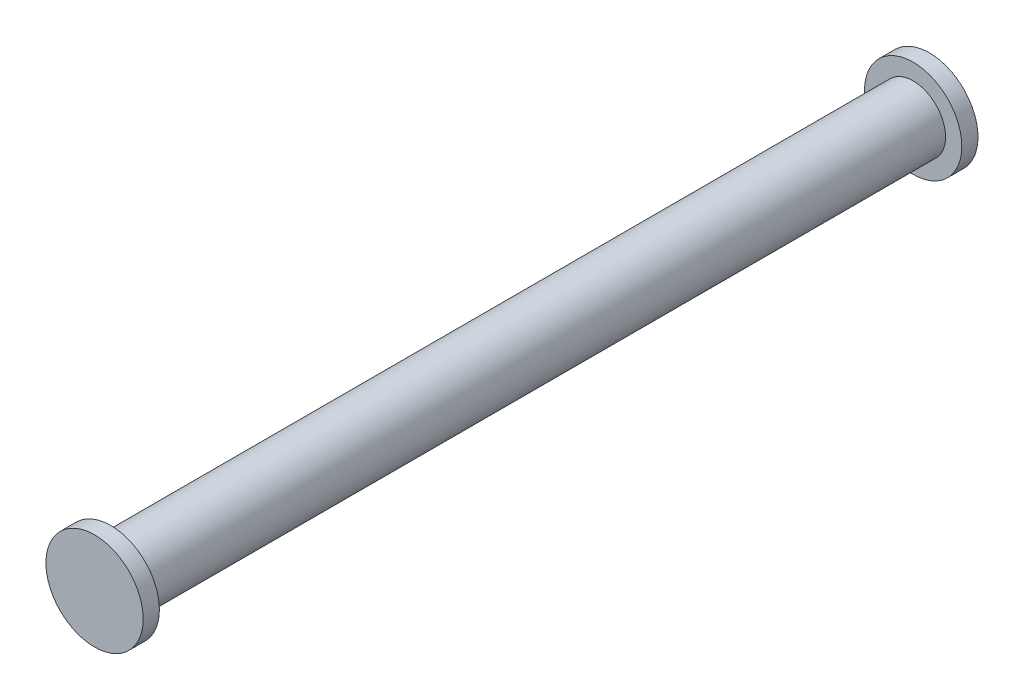
ISO-10303-21;
HEADER;
FILE_DESCRIPTION(('STEP AP214'),'2;1');
FILE_NAME('part.step','',(''),(''),'','','');
FILE_SCHEMA(('AUTOMOTIVE_DESIGN { 1 0 10303 214 1 1 1 1 }'));
ENDSEC;
DATA;
#1=APPLICATION_CONTEXT('core data for automotive mechanical design processes');
#2=APPLICATION_PROTOCOL_DEFINITION('international standard','automotive_design',2000,#1);
#3=PRODUCT_CONTEXT('',#1,'mechanical');
#4=PRODUCT('Part','Part','',(#3));
#5=PRODUCT_RELATED_PRODUCT_CATEGORY('part','',(#4));
#6=PRODUCT_DEFINITION_FORMATION('','',#4);
#7=PRODUCT_DEFINITION_CONTEXT('part definition',#1,'design');
#8=PRODUCT_DEFINITION('design','',#6,#7);
#9=PRODUCT_DEFINITION_SHAPE('','',#8);
#10=(LENGTH_UNIT() NAMED_UNIT(*) SI_UNIT(.MILLI.,.METRE.));
#11=(NAMED_UNIT(*) PLANE_ANGLE_UNIT() SI_UNIT($,.RADIAN.));
#12=(NAMED_UNIT(*) SI_UNIT($,.STERADIAN.) SOLID_ANGLE_UNIT());
#13=UNCERTAINTY_MEASURE_WITH_UNIT(LENGTH_MEASURE(1.E-05),#10,'distance_accuracy_value','');
#14=(GEOMETRIC_REPRESENTATION_CONTEXT(3) GLOBAL_UNCERTAINTY_ASSIGNED_CONTEXT((#13)) GLOBAL_UNIT_ASSIGNED_CONTEXT((#10,
#11,#12)) REPRESENTATION_CONTEXT('',''));
#15=CARTESIAN_POINT('',(0.,0.,0.));
#16=DIRECTION('',(0.,0.,1.));
#17=DIRECTION('',(1.,0.,0.));
#18=AXIS2_PLACEMENT_3D('',#15,#16,#17);
#19=CARTESIAN_POINT('',(0.,0.,2.));
#20=DIRECTION('',(0.,0.,-1.));
#21=DIRECTION('',(-1.,0.,0.));
#22=AXIS2_PLACEMENT_3D('',#19,#20,#21);
#23=CYLINDRICAL_SURFACE('',#22,6.);
#24=CARTESIAN_POINT('',(0.,0.,2.));
#25=DIRECTION('',(0.,0.,1.));
#26=DIRECTION('',(1.,0.,0.));
#27=AXIS2_PLACEMENT_3D('',#24,#25,#26);
#28=CIRCLE('',#27,6.);
#29=CARTESIAN_POINT('',(6.,0.,2.));
#30=VERTEX_POINT('',#29);
#31=EDGE_CURVE('E10',#30,#30,#28,.T.);
#32=ORIENTED_EDGE('',*,*,#31,.F.);
#33=EDGE_LOOP('',(#32));
#34=FACE_BOUND('',#33,.T.);
#35=CARTESIAN_POINT('',(0.,0.,0.));
#36=DIRECTION('',(0.,0.,1.));
#37=DIRECTION('',(1.,0.,0.));
#38=AXIS2_PLACEMENT_3D('',#35,#36,#37);
#39=CIRCLE('',#38,6.);
#40=CARTESIAN_POINT('',(6.,0.,0.));
#41=VERTEX_POINT('',#40);
#42=EDGE_CURVE('E40',#41,#41,#39,.T.);
#43=ORIENTED_EDGE('',*,*,#42,.T.);
#44=EDGE_LOOP('',(#43));
#45=FACE_BOUND('',#44,.T.);
#46=ADVANCED_FACE('F37',(#34,#45),#23,.T.);
#47=CARTESIAN_POINT('',(0.,0.,2.));
#48=DIRECTION('',(0.,0.,1.));
#49=DIRECTION('',(1.,0.,0.));
#50=AXIS2_PLACEMENT_3D('',#47,#48,#49);
#51=PLANE('',#50);
#52=CARTESIAN_POINT('',(0.,0.,2.));
#53=DIRECTION('',(0.,0.,1.));
#54=DIRECTION('',(1.,0.,0.));
#55=AXIS2_PLACEMENT_3D('',#52,#53,#54);
#56=CIRCLE('',#55,4.);
#57=CARTESIAN_POINT('',(4.,0.,2.));
#58=VERTEX_POINT('',#57);
#59=EDGE_CURVE('E51',#58,#58,#56,.T.);
#60=ORIENTED_EDGE('',*,*,#59,.F.);
#61=EDGE_LOOP('',(#60));
#62=FACE_BOUND('',#61,.T.);
#63=ORIENTED_EDGE('',*,*,#31,.T.);
#64=EDGE_LOOP('',(#63));
#65=FACE_BOUND('',#64,.T.);
#66=ADVANCED_FACE('F85',(#62,#65),#51,.T.);
#67=CARTESIAN_POINT('',(0.,0.,0.));
#68=DIRECTION('',(0.,0.,1.));
#69=DIRECTION('',(1.,0.,0.));
#70=AXIS2_PLACEMENT_3D('',#67,#68,#69);
#71=PLANE('',#70);
#72=ORIENTED_EDGE('',*,*,#42,.F.);
#73=EDGE_LOOP('',(#72));
#74=FACE_BOUND('',#73,.T.);
#75=ADVANCED_FACE('F90',(#74),#71,.F.);
#76=CARTESIAN_POINT('',(0.,0.,101.));
#77=DIRECTION('',(0.,0.,-1.));
#78=DIRECTION('',(-1.,0.,0.));
#79=AXIS2_PLACEMENT_3D('',#76,#77,#78);
#80=CYLINDRICAL_SURFACE('',#79,4.);
#81=CARTESIAN_POINT('',(0.,0.,101.));
#82=DIRECTION('',(0.,0.,1.));
#83=DIRECTION('',(1.,0.,0.));
#84=AXIS2_PLACEMENT_3D('',#81,#82,#83);
#85=CIRCLE('',#84,4.);
#86=CARTESIAN_POINT('',(4.,0.,101.));
#87=VERTEX_POINT('',#86);
#88=EDGE_CURVE('E49',#87,#87,#85,.T.);
#89=ORIENTED_EDGE('',*,*,#88,.F.);
#90=EDGE_LOOP('',(#89));
#91=FACE_BOUND('',#90,.T.);
#92=ORIENTED_EDGE('',*,*,#59,.T.);
#93=EDGE_LOOP('',(#92));
#94=FACE_BOUND('',#93,.T.);
#95=ADVANCED_FACE('F72',(#91,#94),#80,.T.);
#96=CARTESIAN_POINT('',(0.,0.,103.));
#97=DIRECTION('',(0.,0.,-1.));
#98=DIRECTION('',(-1.,0.,0.));
#99=AXIS2_PLACEMENT_3D('',#96,#97,#98);
#100=CYLINDRICAL_SURFACE('',#99,6.);
#101=CARTESIAN_POINT('',(0.,0.,103.));
#102=DIRECTION('',(0.,0.,1.));
#103=DIRECTION('',(1.,0.,0.));
#104=AXIS2_PLACEMENT_3D('',#101,#102,#103);
#105=CIRCLE('',#104,6.);
#106=CARTESIAN_POINT('',(6.,0.,103.));
#107=VERTEX_POINT('',#106);
#108=EDGE_CURVE('E55',#107,#107,#105,.T.);
#109=ORIENTED_EDGE('',*,*,#108,.F.);
#110=EDGE_LOOP('',(#109));
#111=FACE_BOUND('',#110,.T.);
#112=CARTESIAN_POINT('',(0.,0.,101.));
#113=DIRECTION('',(0.,0.,1.));
#114=DIRECTION('',(1.,0.,0.));
#115=AXIS2_PLACEMENT_3D('',#112,#113,#114);
#116=CIRCLE('',#115,6.);
#117=CARTESIAN_POINT('',(6.,0.,101.));
#118=VERTEX_POINT('',#117);
#119=EDGE_CURVE('E59',#118,#118,#116,.T.);
#120=ORIENTED_EDGE('',*,*,#119,.T.);
#121=EDGE_LOOP('',(#120));
#122=FACE_BOUND('',#121,.T.);
#123=ADVANCED_FACE('F69',(#111,#122),#100,.T.);
#124=CARTESIAN_POINT('',(0.,0.,103.));
#125=DIRECTION('',(0.,0.,1.));
#126=DIRECTION('',(1.,0.,0.));
#127=AXIS2_PLACEMENT_3D('',#124,#125,#126);
#128=PLANE('',#127);
#129=ORIENTED_EDGE('',*,*,#108,.T.);
#130=EDGE_LOOP('',(#129));
#131=FACE_BOUND('',#130,.T.);
#132=ADVANCED_FACE('F67',(#131),#128,.T.);
#133=CARTESIAN_POINT('',(0.,0.,101.));
#134=DIRECTION('',(0.,0.,1.));
#135=DIRECTION('',(1.,0.,0.));
#136=AXIS2_PLACEMENT_3D('',#133,#134,#135);
#137=PLANE('',#136);
#138=ORIENTED_EDGE('',*,*,#88,.T.);
#139=EDGE_LOOP('',(#138));
#140=FACE_BOUND('',#139,.T.);
#141=ORIENTED_EDGE('',*,*,#119,.F.);
#142=EDGE_LOOP('',(#141));
#143=FACE_BOUND('',#142,.T.);
#144=ADVANCED_FACE('F76',(#140,#143),#137,.F.);
#145=CLOSED_SHELL('',(#46,#66,#75,#95,#123,#132,#144));
#146=MANIFOLD_SOLID_BREP('B2',#145);
#147=ADVANCED_BREP_SHAPE_REPRESENTATION('',(#18,#146),#14);
#148=SHAPE_DEFINITION_REPRESENTATION(#9,#147);
ENDSEC;
END-ISO-10303-21;
